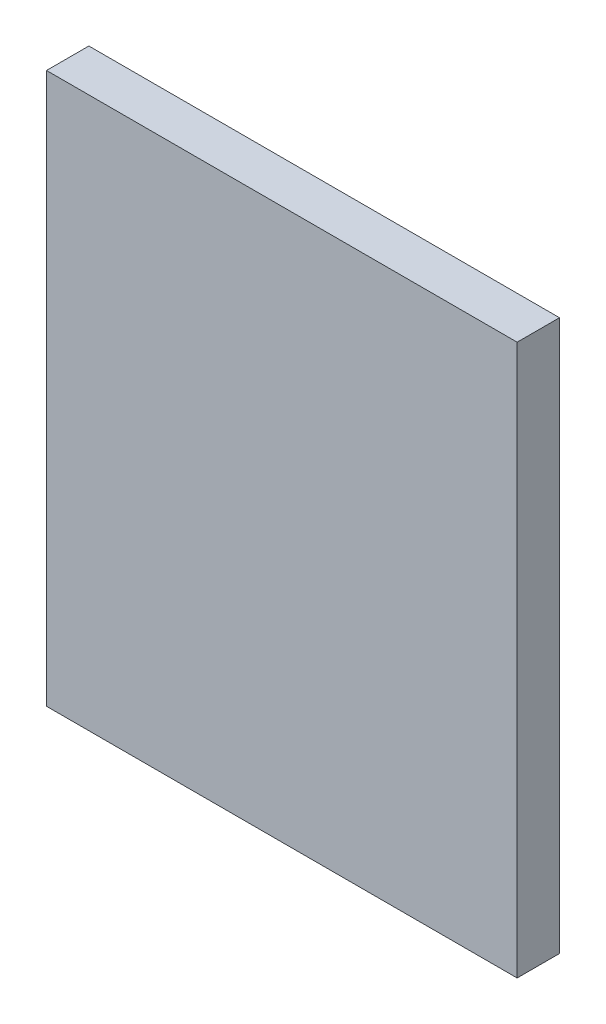
ISO-10303-21;
HEADER;
FILE_DESCRIPTION(('STEP AP214'),'2;1');
FILE_NAME('part.step','',(''),(''),'','','');
FILE_SCHEMA(('AUTOMOTIVE_DESIGN { 1 0 10303 214 1 1 1 1 }'));
ENDSEC;
DATA;
#1=APPLICATION_CONTEXT('core data for automotive mechanical design processes');
#2=APPLICATION_PROTOCOL_DEFINITION('international standard','automotive_design',2000,#1);
#3=PRODUCT_CONTEXT('',#1,'mechanical');
#4=PRODUCT('Part','Part','',(#3));
#5=PRODUCT_RELATED_PRODUCT_CATEGORY('part','',(#4));
#6=PRODUCT_DEFINITION_FORMATION('','',#4);
#7=PRODUCT_DEFINITION_CONTEXT('part definition',#1,'design');
#8=PRODUCT_DEFINITION('design','',#6,#7);
#9=PRODUCT_DEFINITION_SHAPE('','',#8);
#10=(LENGTH_UNIT() NAMED_UNIT(*) SI_UNIT(.MILLI.,.METRE.));
#11=(NAMED_UNIT(*) PLANE_ANGLE_UNIT() SI_UNIT($,.RADIAN.));
#12=(NAMED_UNIT(*) SI_UNIT($,.STERADIAN.) SOLID_ANGLE_UNIT());
#13=UNCERTAINTY_MEASURE_WITH_UNIT(LENGTH_MEASURE(1.E-05),#10,'distance_accuracy_value','');
#14=(GEOMETRIC_REPRESENTATION_CONTEXT(3) GLOBAL_UNCERTAINTY_ASSIGNED_CONTEXT((#13)) GLOBAL_UNIT_ASSIGNED_CONTEXT((#10,
#11,#12)) REPRESENTATION_CONTEXT('',''));
#15=CARTESIAN_POINT('',(0.,0.,0.));
#16=DIRECTION('',(0.,0.,1.));
#17=DIRECTION('',(1.,0.,0.));
#18=AXIS2_PLACEMENT_3D('',#15,#16,#17);
#19=CARTESIAN_POINT('',(100.,117.,18.));
#20=DIRECTION('',(-1.,0.,0.));
#21=DIRECTION('',(0.,-1.,0.));
#22=AXIS2_PLACEMENT_3D('',#19,#20,#21);
#23=PLANE('',#22);
#24=DIRECTION('',(0.,1.,0.));
#25=VECTOR('',#24,1.);
#26=CARTESIAN_POINT('',(100.,117.,0.));
#27=LINE('',#26,#25);
#28=CARTESIAN_POINT('',(100.,-117.,0.));
#29=VERTEX_POINT('',#28);
#30=CARTESIAN_POINT('',(100.,117.,0.));
#31=VERTEX_POINT('',#30);
#32=EDGE_CURVE('E96',#29,#31,#27,.T.);
#33=ORIENTED_EDGE('',*,*,#32,.T.);
#34=DIRECTION('',(0.,0.,-1.));
#35=VECTOR('',#34,1.);
#36=CARTESIAN_POINT('',(100.,117.,18.));
#37=LINE('',#36,#35);
#38=CARTESIAN_POINT('',(100.,117.,18.));
#39=VERTEX_POINT('',#38);
#40=EDGE_CURVE('E11',#39,#31,#37,.T.);
#41=ORIENTED_EDGE('',*,*,#40,.F.);
#42=DIRECTION('',(0.,1.,0.));
#43=VECTOR('',#42,1.);
#44=CARTESIAN_POINT('',(100.,117.,18.));
#45=LINE('',#44,#43);
#46=CARTESIAN_POINT('',(100.,-117.,18.));
#47=VERTEX_POINT('',#46);
#48=EDGE_CURVE('E84',#47,#39,#45,.T.);
#49=ORIENTED_EDGE('',*,*,#48,.F.);
#50=DIRECTION('',(0.,0.,-1.));
#51=VECTOR('',#50,1.);
#52=CARTESIAN_POINT('',(100.,-117.,18.));
#53=LINE('',#52,#51);
#54=EDGE_CURVE('E92',#47,#29,#53,.T.);
#55=ORIENTED_EDGE('',*,*,#54,.T.);
#56=EDGE_LOOP('',(#33,#41,#49,#55));
#57=FACE_BOUND('',#56,.T.);
#58=ADVANCED_FACE('F33',(#57),#23,.F.);
#59=CARTESIAN_POINT('',(-100.,117.,18.));
#60=DIRECTION('',(0.,-1.,0.));
#61=DIRECTION('',(0.,0.,-1.));
#62=AXIS2_PLACEMENT_3D('',#59,#60,#61);
#63=PLANE('',#62);
#64=DIRECTION('',(-1.,0.,0.));
#65=VECTOR('',#64,1.);
#66=CARTESIAN_POINT('',(-100.,117.,0.));
#67=LINE('',#66,#65);
#68=CARTESIAN_POINT('',(-100.,117.,0.));
#69=VERTEX_POINT('',#68);
#70=EDGE_CURVE('E88',#31,#69,#67,.T.);
#71=ORIENTED_EDGE('',*,*,#70,.T.);
#72=DIRECTION('',(0.,0.,-1.));
#73=VECTOR('',#72,1.);
#74=CARTESIAN_POINT('',(-100.,117.,18.));
#75=LINE('',#74,#73);
#76=CARTESIAN_POINT('',(-100.,117.,18.));
#77=VERTEX_POINT('',#76);
#78=EDGE_CURVE('E41',#77,#69,#75,.T.);
#79=ORIENTED_EDGE('',*,*,#78,.F.);
#80=DIRECTION('',(-1.,0.,0.));
#81=VECTOR('',#80,1.);
#82=CARTESIAN_POINT('',(-100.,117.,18.));
#83=LINE('',#82,#81);
#84=EDGE_CURVE('E79',#39,#77,#83,.T.);
#85=ORIENTED_EDGE('',*,*,#84,.F.);
#86=ORIENTED_EDGE('',*,*,#40,.T.);
#87=EDGE_LOOP('',(#71,#79,#85,#86));
#88=FACE_BOUND('',#87,.T.);
#89=ADVANCED_FACE('F87',(#88),#63,.F.);
#90=CARTESIAN_POINT('',(-100.,117.,18.));
#91=DIRECTION('',(1.,0.,0.));
#92=DIRECTION('',(0.,1.,0.));
#93=AXIS2_PLACEMENT_3D('',#90,#91,#92);
#94=PLANE('',#93);
#95=DIRECTION('',(0.,-1.,0.));
#96=VECTOR('',#95,1.);
#97=CARTESIAN_POINT('',(-100.,117.,0.));
#98=LINE('',#97,#96);
#99=CARTESIAN_POINT('',(-100.,-117.,0.));
#100=VERTEX_POINT('',#99);
#101=EDGE_CURVE('E66',#69,#100,#98,.T.);
#102=ORIENTED_EDGE('',*,*,#101,.T.);
#103=DIRECTION('',(0.,0.,-1.));
#104=VECTOR('',#103,1.);
#105=CARTESIAN_POINT('',(-100.,-117.,18.));
#106=LINE('',#105,#104);
#107=CARTESIAN_POINT('',(-100.,-117.,18.));
#108=VERTEX_POINT('',#107);
#109=EDGE_CURVE('E89',#108,#100,#106,.T.);
#110=ORIENTED_EDGE('',*,*,#109,.F.);
#111=DIRECTION('',(0.,-1.,0.));
#112=VECTOR('',#111,1.);
#113=CARTESIAN_POINT('',(-100.,117.,18.));
#114=LINE('',#113,#112);
#115=EDGE_CURVE('E82',#77,#108,#114,.T.);
#116=ORIENTED_EDGE('',*,*,#115,.F.);
#117=ORIENTED_EDGE('',*,*,#78,.T.);
#118=EDGE_LOOP('',(#102,#110,#116,#117));
#119=FACE_BOUND('',#118,.T.);
#120=ADVANCED_FACE('F90',(#119),#94,.F.);
#121=CARTESIAN_POINT('',(-100.,-117.,18.));
#122=DIRECTION('',(0.,1.,0.));
#123=DIRECTION('',(0.,0.,1.));
#124=AXIS2_PLACEMENT_3D('',#121,#122,#123);
#125=PLANE('',#124);
#126=DIRECTION('',(1.,0.,0.));
#127=VECTOR('',#126,1.);
#128=CARTESIAN_POINT('',(-100.,-117.,0.));
#129=LINE('',#128,#127);
#130=EDGE_CURVE('E72',#100,#29,#129,.T.);
#131=ORIENTED_EDGE('',*,*,#130,.T.);
#132=ORIENTED_EDGE('',*,*,#54,.F.);
#133=DIRECTION('',(1.,0.,0.));
#134=VECTOR('',#133,1.);
#135=CARTESIAN_POINT('',(-100.,-117.,18.));
#136=LINE('',#135,#134);
#137=EDGE_CURVE('E49',#108,#47,#136,.T.);
#138=ORIENTED_EDGE('',*,*,#137,.F.);
#139=ORIENTED_EDGE('',*,*,#109,.T.);
#140=EDGE_LOOP('',(#131,#132,#138,#139));
#141=FACE_BOUND('',#140,.T.);
#142=ADVANCED_FACE('F103',(#141),#125,.F.);
#143=CARTESIAN_POINT('',(0.,0.,18.));
#144=DIRECTION('',(0.,0.,1.));
#145=DIRECTION('',(1.,0.,0.));
#146=AXIS2_PLACEMENT_3D('',#143,#144,#145);
#147=PLANE('',#146);
#148=ORIENTED_EDGE('',*,*,#48,.T.);
#149=ORIENTED_EDGE('',*,*,#84,.T.);
#150=ORIENTED_EDGE('',*,*,#115,.T.);
#151=ORIENTED_EDGE('',*,*,#137,.T.);
#152=EDGE_LOOP('',(#148,#149,#150,#151));
#153=FACE_BOUND('',#152,.T.);
#154=ADVANCED_FACE('F80',(#153),#147,.T.);
#155=CARTESIAN_POINT('',(0.,0.,0.));
#156=DIRECTION('',(0.,0.,1.));
#157=DIRECTION('',(1.,0.,0.));
#158=AXIS2_PLACEMENT_3D('',#155,#156,#157);
#159=PLANE('',#158);
#160=ORIENTED_EDGE('',*,*,#32,.F.);
#161=ORIENTED_EDGE('',*,*,#130,.F.);
#162=ORIENTED_EDGE('',*,*,#101,.F.);
#163=ORIENTED_EDGE('',*,*,#70,.F.);
#164=EDGE_LOOP('',(#160,#161,#162,#163));
#165=FACE_BOUND('',#164,.T.);
#166=ADVANCED_FACE('F106',(#165),#159,.F.);
#167=CLOSED_SHELL('',(#58,#89,#120,#142,#154,#166));
#168=MANIFOLD_SOLID_BREP('B2',#167);
#169=ADVANCED_BREP_SHAPE_REPRESENTATION('',(#18,#168),#14);
#170=SHAPE_DEFINITION_REPRESENTATION(#9,#169);
ENDSEC;
END-ISO-10303-21;
